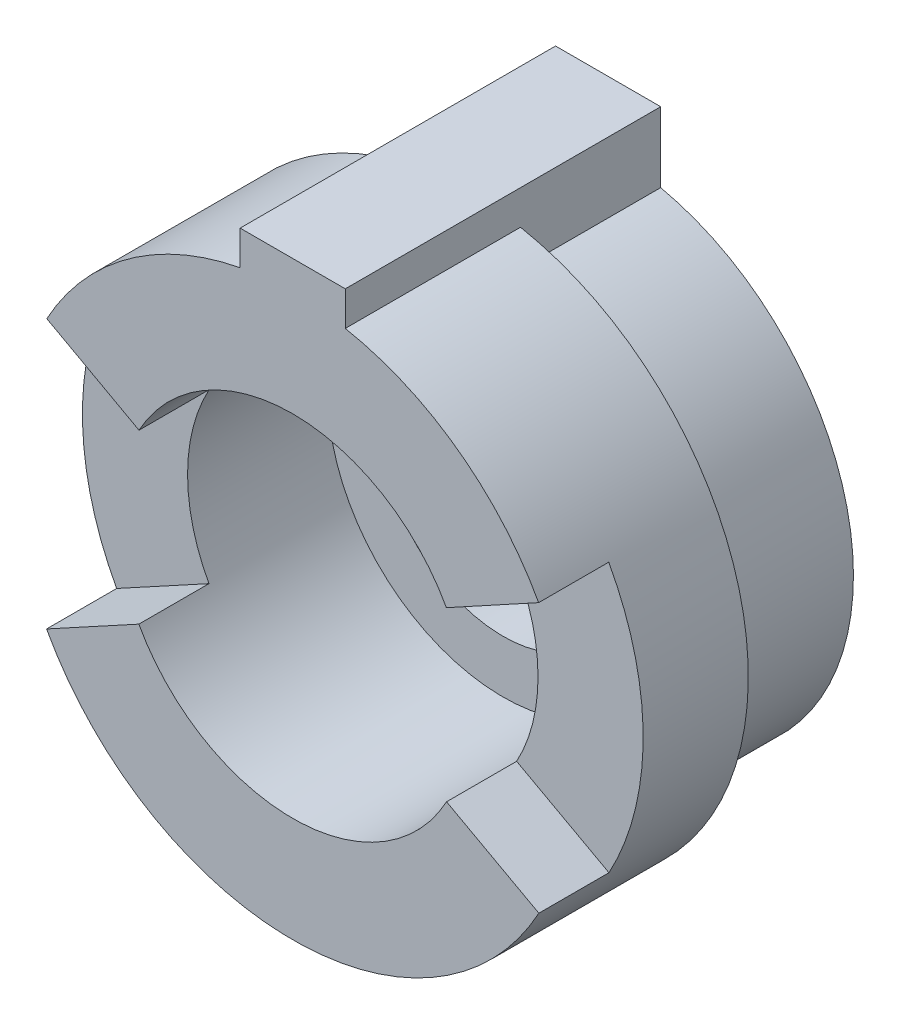
ISO-10303-21;
HEADER;
FILE_DESCRIPTION(('STEP AP214'),'2;1');
FILE_NAME('part.step','',(''),(''),'','','');
FILE_SCHEMA(('AUTOMOTIVE_DESIGN { 1 0 10303 214 1 1 1 1 }'));
ENDSEC;
DATA;
#1=APPLICATION_CONTEXT('core data for automotive mechanical design processes');
#2=APPLICATION_PROTOCOL_DEFINITION('international standard','automotive_design',2000,#1);
#3=PRODUCT_CONTEXT('',#1,'mechanical');
#4=PRODUCT('Part','Part','',(#3));
#5=PRODUCT_RELATED_PRODUCT_CATEGORY('part','',(#4));
#6=PRODUCT_DEFINITION_FORMATION('','',#4);
#7=PRODUCT_DEFINITION_CONTEXT('part definition',#1,'design');
#8=PRODUCT_DEFINITION('design','',#6,#7);
#9=PRODUCT_DEFINITION_SHAPE('','',#8);
#10=(LENGTH_UNIT() NAMED_UNIT(*) SI_UNIT(.MILLI.,.METRE.));
#11=(NAMED_UNIT(*) PLANE_ANGLE_UNIT() SI_UNIT($,.RADIAN.));
#12=(NAMED_UNIT(*) SI_UNIT($,.STERADIAN.) SOLID_ANGLE_UNIT());
#13=UNCERTAINTY_MEASURE_WITH_UNIT(LENGTH_MEASURE(1.E-05),#10,'distance_accuracy_value','');
#14=(GEOMETRIC_REPRESENTATION_CONTEXT(3) GLOBAL_UNCERTAINTY_ASSIGNED_CONTEXT((#13)) GLOBAL_UNIT_ASSIGNED_CONTEXT((#10,
#11,#12)) REPRESENTATION_CONTEXT('',''));
#15=CARTESIAN_POINT('',(0.,0.,0.));
#16=DIRECTION('',(0.,0.,1.));
#17=DIRECTION('',(1.,0.,0.));
#18=AXIS2_PLACEMENT_3D('',#15,#16,#17);
#19=CARTESIAN_POINT('',(0.,0.,9.));
#20=DIRECTION('',(0.,0.,1.));
#21=DIRECTION('',(1.,0.,0.));
#22=AXIS2_PLACEMENT_3D('',#19,#20,#21);
#23=PLANE('',#22);
#24=DIRECTION('',(-0.877200504274681,0.480124229028535,0.));
#25=VECTOR('',#24,1.);
#26=CARTESIAN_POINT('',(-7.01760403419745,3.84099383222828,9.));
#27=LINE('',#26,#25);
#28=CARTESIAN_POINT('',(-4.38600252137341,2.40062114514268,9.));
#29=VERTEX_POINT('',#28);
#30=CARTESIAN_POINT('',(-7.01760403419745,3.84099383222828,9.));
#31=VERTEX_POINT('',#30);
#32=EDGE_CURVE('E238',#29,#31,#27,.T.);
#33=ORIENTED_EDGE('',*,*,#32,.F.);
#34=CARTESIAN_POINT('',(0.,0.,9.));
#35=DIRECTION('',(0.,0.,1.));
#36=DIRECTION('',(1.,0.,0.));
#37=AXIS2_PLACEMENT_3D('',#34,#35,#36);
#38=CIRCLE('',#37,5.);
#39=CARTESIAN_POINT('',(4.38600252137341,2.40062114514267,9.));
#40=VERTEX_POINT('',#39);
#41=EDGE_CURVE('E260',#40,#29,#38,.T.);
#42=ORIENTED_EDGE('',*,*,#41,.F.);
#43=DIRECTION('',(0.877200504274682,0.480124229028534,0.));
#44=VECTOR('',#43,1.);
#45=CARTESIAN_POINT('',(7.01760403419745,3.84099383222827,9.));
#46=LINE('',#45,#44);
#47=CARTESIAN_POINT('',(7.01760403419745,3.84099383222827,9.));
#48=VERTEX_POINT('',#47);
#49=EDGE_CURVE('E92',#40,#48,#46,.T.);
#50=ORIENTED_EDGE('',*,*,#49,.T.);
#51=CARTESIAN_POINT('',(0.,0.,9.));
#52=DIRECTION('',(0.,0.,1.));
#53=DIRECTION('',(1.,0.,0.));
#54=AXIS2_PLACEMENT_3D('',#51,#52,#53);
#55=CIRCLE('',#54,8.);
#56=CARTESIAN_POINT('',(1.50000000000014,7.85811682275083,9.));
#57=VERTEX_POINT('',#56);
#58=EDGE_CURVE('E190',#48,#57,#55,.T.);
#59=ORIENTED_EDGE('',*,*,#58,.T.);
#60=DIRECTION('',(0.,-1.,0.));
#61=VECTOR('',#60,1.);
#62=CARTESIAN_POINT('',(1.50000000000014,7.85811682275083,9.));
#63=LINE('',#62,#61);
#64=CARTESIAN_POINT('',(1.50000000000014,8.83739716558864,9.));
#65=VERTEX_POINT('',#64);
#66=EDGE_CURVE('E171',#65,#57,#63,.T.);
#67=ORIENTED_EDGE('',*,*,#66,.F.);
#68=DIRECTION('',(1.,0.,0.));
#69=VECTOR('',#68,1.);
#70=CARTESIAN_POINT('',(1.50000000000014,8.83739716558864,9.));
#71=LINE('',#70,#69);
#72=CARTESIAN_POINT('',(-1.49999999999986,8.83739716558864,9.));
#73=VERTEX_POINT('',#72);
#74=EDGE_CURVE('E187',#73,#65,#71,.T.);
#75=ORIENTED_EDGE('',*,*,#74,.F.);
#76=DIRECTION('',(0.,1.,0.));
#77=VECTOR('',#76,1.);
#78=CARTESIAN_POINT('',(-1.49999999999986,8.83739716558864,9.));
#79=LINE('',#78,#77);
#80=CARTESIAN_POINT('',(-1.49999999999986,7.85811682275088,9.));
#81=VERTEX_POINT('',#80);
#82=EDGE_CURVE('E180',#81,#73,#79,.T.);
#83=ORIENTED_EDGE('',*,*,#82,.F.);
#84=EDGE_CURVE('E266',#81,#31,#55,.T.);
#85=ORIENTED_EDGE('',*,*,#84,.T.);
#86=EDGE_LOOP('',(#33,#42,#50,#59,#67,#75,#83,#85));
#87=FACE_BOUND('',#86,.T.);
#88=ADVANCED_FACE('F69',(#87),#23,.T.);
#89=CARTESIAN_POINT('',(0.,0.,3.));
#90=DIRECTION('',(0.,0.,1.));
#91=DIRECTION('',(1.,0.,0.));
#92=AXIS2_PLACEMENT_3D('',#89,#90,#91);
#93=PLANE('',#92);
#94=CARTESIAN_POINT('',(0.,0.,3.));
#95=DIRECTION('',(0.,0.,1.));
#96=DIRECTION('',(1.,0.,0.));
#97=AXIS2_PLACEMENT_3D('',#94,#95,#96);
#98=CIRCLE('',#97,5.);
#99=CARTESIAN_POINT('',(5.,0.,3.));
#100=VERTEX_POINT('',#99);
#101=EDGE_CURVE('E270',#100,#100,#98,.F.);
#102=ORIENTED_EDGE('',*,*,#101,.F.);
#103=EDGE_LOOP('',(#102));
#104=FACE_BOUND('',#103,.T.);
#105=CARTESIAN_POINT('',(0.,0.,3.));
#106=DIRECTION('',(0.,0.,1.));
#107=DIRECTION('',(1.,0.,0.));
#108=AXIS2_PLACEMENT_3D('',#105,#106,#107);
#109=CIRCLE('',#108,3.5);
#110=CARTESIAN_POINT('',(3.5,0.,3.));
#111=VERTEX_POINT('',#110);
#112=EDGE_CURVE('E267',#111,#111,#109,.T.);
#113=ORIENTED_EDGE('',*,*,#112,.F.);
#114=EDGE_LOOP('',(#113));
#115=FACE_BOUND('',#114,.T.);
#116=ADVANCED_FACE('F342',(#104,#115),#93,.T.);
#117=CARTESIAN_POINT('',(0.,0.,0.));
#118=DIRECTION('',(0.,0.,1.));
#119=DIRECTION('',(1.,0.,0.));
#120=AXIS2_PLACEMENT_3D('',#117,#118,#119);
#121=PLANE('',#120);
#122=DIRECTION('',(0.,-1.,0.));
#123=VECTOR('',#122,1.);
#124=CARTESIAN_POINT('',(-1.49999999999986,7.85811682275088,0.));
#125=LINE('',#124,#123);
#126=CARTESIAN_POINT('',(-1.49999999999986,8.83739716558864,0.));
#127=VERTEX_POINT('',#126);
#128=CARTESIAN_POINT('',(-1.49999999999987,6.8373971655887,0.));
#129=VERTEX_POINT('',#128);
#130=EDGE_CURVE('E201',#127,#129,#125,.T.);
#131=ORIENTED_EDGE('',*,*,#130,.F.);
#132=DIRECTION('',(1.,0.,0.));
#133=VECTOR('',#132,1.);
#134=CARTESIAN_POINT('',(1.50000000000014,8.83739716558864,0.));
#135=LINE('',#134,#133);
#136=CARTESIAN_POINT('',(1.50000000000014,8.83739716558864,0.));
#137=VERTEX_POINT('',#136);
#138=EDGE_CURVE('E195',#127,#137,#135,.T.);
#139=ORIENTED_EDGE('',*,*,#138,.T.);
#140=DIRECTION('',(0.,1.,0.));
#141=VECTOR('',#140,1.);
#142=CARTESIAN_POINT('',(1.50000000000014,6.83739716558864,0.));
#143=LINE('',#142,#141);
#144=CARTESIAN_POINT('',(1.50000000000014,6.83739716558864,0.));
#145=VERTEX_POINT('',#144);
#146=EDGE_CURVE('E174',#145,#137,#143,.T.);
#147=ORIENTED_EDGE('',*,*,#146,.F.);
#148=CARTESIAN_POINT('',(0.,0.,0.));
#149=DIRECTION('',(0.,0.,1.));
#150=DIRECTION('',(-1.,0.,0.));
#151=AXIS2_PLACEMENT_3D('',#148,#149,#150);
#152=CIRCLE('',#151,7.);
#153=EDGE_CURVE('E220',#129,#145,#152,.T.);
#154=ORIENTED_EDGE('',*,*,#153,.F.);
#155=EDGE_LOOP('',(#131,#139,#147,#154));
#156=FACE_BOUND('',#155,.T.);
#157=CARTESIAN_POINT('',(0.,0.,0.));
#158=DIRECTION('',(0.,0.,1.));
#159=DIRECTION('',(1.,0.,0.));
#160=AXIS2_PLACEMENT_3D('',#157,#158,#159);
#161=CIRCLE('',#160,3.5);
#162=CARTESIAN_POINT('',(3.5,0.,0.));
#163=VERTEX_POINT('',#162);
#164=EDGE_CURVE('E265',#163,#163,#161,.T.);
#165=ORIENTED_EDGE('',*,*,#164,.T.);
#166=EDGE_LOOP('',(#165));
#167=FACE_BOUND('',#166,.T.);
#168=ADVANCED_FACE('F328',(#156,#167),#121,.F.);
#169=CARTESIAN_POINT('',(0.,0.,3.));
#170=DIRECTION('',(0.,0.,-1.));
#171=DIRECTION('',(-1.,0.,0.));
#172=AXIS2_PLACEMENT_3D('',#169,#170,#171);
#173=CYLINDRICAL_SURFACE('',#172,8.);
#174=ORIENTED_EDGE('',*,*,#84,.F.);
#175=DIRECTION('',(0.,0.,-1.));
#176=VECTOR('',#175,1.);
#177=CARTESIAN_POINT('',(-1.49999999999986,7.85811682275088,9.));
#178=LINE('',#177,#176);
#179=CARTESIAN_POINT('',(-1.49999999999986,7.85811682275088,4.));
#180=VERTEX_POINT('',#179);
#181=EDGE_CURVE('E202',#81,#180,#178,.T.);
#182=ORIENTED_EDGE('',*,*,#181,.T.);
#183=CARTESIAN_POINT('',(0.,0.,4.));
#184=DIRECTION('',(0.,0.,-1.));
#185=DIRECTION('',(-1.,0.,0.));
#186=AXIS2_PLACEMENT_3D('',#183,#184,#185);
#187=CIRCLE('',#186,8.);
#188=CARTESIAN_POINT('',(1.50000000000014,7.85811682275083,4.));
#189=VERTEX_POINT('',#188);
#190=EDGE_CURVE('E205',#189,#180,#187,.T.);
#191=ORIENTED_EDGE('',*,*,#190,.F.);
#192=DIRECTION('',(0.,0.,-1.));
#193=VECTOR('',#192,1.);
#194=CARTESIAN_POINT('',(1.50000000000014,7.85811682275083,9.));
#195=LINE('',#194,#193);
#196=EDGE_CURVE('E179',#57,#189,#195,.T.);
#197=ORIENTED_EDGE('',*,*,#196,.F.);
#198=ORIENTED_EDGE('',*,*,#58,.F.);
#199=DIRECTION('',(0.,0.,1.));
#200=VECTOR('',#199,1.);
#201=CARTESIAN_POINT('',(7.01760403419745,3.84099383222827,7.));
#202=LINE('',#201,#200);
#203=CARTESIAN_POINT('',(7.01760403419745,3.84099383222827,7.));
#204=VERTEX_POINT('',#203);
#205=EDGE_CURVE('E246',#204,#48,#202,.T.);
#206=ORIENTED_EDGE('',*,*,#205,.F.);
#207=CARTESIAN_POINT('',(0.,0.,7.));
#208=DIRECTION('',(0.,0.,-1.));
#209=DIRECTION('',(0.877964062999077,-0.478726544158722,0.));
#210=AXIS2_PLACEMENT_3D('',#207,#208,#209);
#211=CIRCLE('',#210,8.);
#212=CARTESIAN_POINT('',(7.02371250399262,-3.82981235326977,7.));
#213=VERTEX_POINT('',#212);
#214=EDGE_CURVE('E242',#204,#213,#211,.T.);
#215=ORIENTED_EDGE('',*,*,#214,.T.);
#216=DIRECTION('',(0.,0.,-1.));
#217=VECTOR('',#216,1.);
#218=CARTESIAN_POINT('',(7.02371250399262,-3.82981235326977,9.));
#219=LINE('',#218,#217);
#220=CARTESIAN_POINT('',(7.02371250399262,-3.82981235326977,9.));
#221=VERTEX_POINT('',#220);
#222=EDGE_CURVE('E248',#221,#213,#219,.T.);
#223=ORIENTED_EDGE('',*,*,#222,.F.);
#224=CARTESIAN_POINT('',(-7.02371250399263,-3.82981235326976,9.));
#225=VERTEX_POINT('',#224);
#226=EDGE_CURVE('E263',#225,#221,#55,.T.);
#227=ORIENTED_EDGE('',*,*,#226,.F.);
#228=DIRECTION('',(0.,0.,1.));
#229=VECTOR('',#228,1.);
#230=CARTESIAN_POINT('',(-7.02371250399263,-3.82981235326976,7.));
#231=LINE('',#230,#229);
#232=CARTESIAN_POINT('',(-7.02371250399263,-3.82981235326976,7.));
#233=VERTEX_POINT('',#232);
#234=EDGE_CURVE('E230',#233,#225,#231,.T.);
#235=ORIENTED_EDGE('',*,*,#234,.F.);
#236=CARTESIAN_POINT('',(0.,0.,7.));
#237=DIRECTION('',(0.,0.,-1.));
#238=DIRECTION('',(-0.877200504274681,0.480124229028534,0.));
#239=AXIS2_PLACEMENT_3D('',#236,#237,#238);
#240=CIRCLE('',#239,8.);
#241=CARTESIAN_POINT('',(-7.01760403419745,3.84099383222828,7.));
#242=VERTEX_POINT('',#241);
#243=EDGE_CURVE('E226',#233,#242,#240,.T.);
#244=ORIENTED_EDGE('',*,*,#243,.T.);
#245=DIRECTION('',(0.,0.,-1.));
#246=VECTOR('',#245,1.);
#247=CARTESIAN_POINT('',(-7.01760403419745,3.84099383222828,9.));
#248=LINE('',#247,#246);
#249=EDGE_CURVE('E232',#31,#242,#248,.T.);
#250=ORIENTED_EDGE('',*,*,#249,.F.);
#251=EDGE_LOOP('',(#174,#182,#191,#197,#198,#206,#215,#223,#227,#235,#244,#250));
#252=FACE_BOUND('',#251,.T.);
#253=ADVANCED_FACE('F71',(#252),#173,.T.);
#254=CARTESIAN_POINT('',(0.,0.,3.));
#255=DIRECTION('',(0.,0.,-1.));
#256=DIRECTION('',(-1.,0.,0.));
#257=AXIS2_PLACEMENT_3D('',#254,#255,#256);
#258=CYLINDRICAL_SURFACE('',#257,3.5);
#259=ORIENTED_EDGE('',*,*,#112,.T.);
#260=EDGE_LOOP('',(#259));
#261=FACE_BOUND('',#260,.T.);
#262=ORIENTED_EDGE('',*,*,#164,.F.);
#263=EDGE_LOOP('',(#262));
#264=FACE_BOUND('',#263,.T.);
#265=ADVANCED_FACE('F352',(#261,#264),#258,.F.);
#266=DIRECTION('',(-0.877964062999078,-0.47872654415872,0.));
#267=VECTOR('',#266,1.);
#268=CARTESIAN_POINT('',(-7.02371250399263,-3.82981235326976,9.));
#269=LINE('',#268,#267);
#270=CARTESIAN_POINT('',(-4.38982031499539,-2.3936327207936,9.));
#271=VERTEX_POINT('',#270);
#272=EDGE_CURVE('E84',#271,#225,#269,.T.);
#273=ORIENTED_EDGE('',*,*,#272,.T.);
#274=ORIENTED_EDGE('',*,*,#226,.T.);
#275=DIRECTION('',(0.877964062999077,-0.478726544158722,0.));
#276=VECTOR('',#275,1.);
#277=CARTESIAN_POINT('',(7.02371250399262,-3.82981235326977,9.));
#278=LINE('',#277,#276);
#279=CARTESIAN_POINT('',(4.38982031499539,-2.39363272079361,9.));
#280=VERTEX_POINT('',#279);
#281=EDGE_CURVE('E254',#280,#221,#278,.T.);
#282=ORIENTED_EDGE('',*,*,#281,.F.);
#283=EDGE_CURVE('E258',#271,#280,#38,.T.);
#284=ORIENTED_EDGE('',*,*,#283,.F.);
#285=EDGE_LOOP('',(#273,#274,#282,#284));
#286=FACE_BOUND('',#285,.T.);
#287=ADVANCED_FACE('F306',(#286),#23,.T.);
#288=CARTESIAN_POINT('',(0.,0.,9.));
#289=DIRECTION('',(0.,0.,-1.));
#290=DIRECTION('',(-1.,0.,0.));
#291=AXIS2_PLACEMENT_3D('',#288,#289,#290);
#292=CYLINDRICAL_SURFACE('',#291,5.);
#293=DIRECTION('',(0.,0.,-1.));
#294=VECTOR('',#293,1.);
#295=CARTESIAN_POINT('',(-4.38600252137341,2.40062114514268,9.));
#296=LINE('',#295,#294);
#297=CARTESIAN_POINT('',(-4.38600252137341,2.40062114514268,7.));
#298=VERTEX_POINT('',#297);
#299=EDGE_CURVE('E13',#298,#29,#296,.F.);
#300=ORIENTED_EDGE('',*,*,#299,.F.);
#301=CARTESIAN_POINT('',(0.,0.,7.));
#302=DIRECTION('',(0.,0.,1.));
#303=DIRECTION('',(1.,0.,0.));
#304=AXIS2_PLACEMENT_3D('',#301,#302,#303);
#305=CIRCLE('',#304,5.);
#306=CARTESIAN_POINT('',(-4.38982031499539,-2.3936327207936,7.));
#307=VERTEX_POINT('',#306);
#308=EDGE_CURVE('E77',#307,#298,#305,.F.);
#309=ORIENTED_EDGE('',*,*,#308,.F.);
#310=DIRECTION('',(0.,0.,-1.));
#311=VECTOR('',#310,1.);
#312=CARTESIAN_POINT('',(-4.38982031499539,-2.3936327207936,9.));
#313=LINE('',#312,#311);
#314=EDGE_CURVE('E282',#271,#307,#313,.T.);
#315=ORIENTED_EDGE('',*,*,#314,.F.);
#316=ORIENTED_EDGE('',*,*,#283,.T.);
#317=DIRECTION('',(0.,0.,-1.));
#318=VECTOR('',#317,1.);
#319=CARTESIAN_POINT('',(4.38982031499539,-2.39363272079361,9.));
#320=LINE('',#319,#318);
#321=CARTESIAN_POINT('',(4.38982031499539,-2.39363272079361,7.));
#322=VERTEX_POINT('',#321);
#323=EDGE_CURVE('E279',#322,#280,#320,.F.);
#324=ORIENTED_EDGE('',*,*,#323,.F.);
#325=CARTESIAN_POINT('',(0.,0.,7.));
#326=DIRECTION('',(0.,0.,1.));
#327=DIRECTION('',(1.,0.,0.));
#328=AXIS2_PLACEMENT_3D('',#325,#326,#327);
#329=CIRCLE('',#328,5.);
#330=CARTESIAN_POINT('',(4.38600252137341,2.40062114514267,7.));
#331=VERTEX_POINT('',#330);
#332=EDGE_CURVE('E277',#331,#322,#329,.F.);
#333=ORIENTED_EDGE('',*,*,#332,.F.);
#334=DIRECTION('',(0.,0.,-1.));
#335=VECTOR('',#334,1.);
#336=CARTESIAN_POINT('',(4.38600252137341,2.40062114514267,9.));
#337=LINE('',#336,#335);
#338=EDGE_CURVE('E275',#40,#331,#337,.T.);
#339=ORIENTED_EDGE('',*,*,#338,.F.);
#340=ORIENTED_EDGE('',*,*,#41,.T.);
#341=EDGE_LOOP('',(#300,#309,#315,#316,#324,#333,#339,#340));
#342=FACE_BOUND('',#341,.T.);
#343=ORIENTED_EDGE('',*,*,#101,.T.);
#344=EDGE_LOOP('',(#343));
#345=FACE_BOUND('',#344,.T.);
#346=ADVANCED_FACE('F294',(#342,#345),#292,.F.);
#347=CARTESIAN_POINT('',(7.02371250399262,-3.82981235326977,8.));
#348=DIRECTION('',(-0.478726544158722,-0.877964062999077,0.));
#349=DIRECTION('',(0.,0.,-1.));
#350=AXIS2_PLACEMENT_3D('',#347,#348,#349);
#351=PLANE('',#350);
#352=ORIENTED_EDGE('',*,*,#323,.T.);
#353=ORIENTED_EDGE('',*,*,#281,.T.);
#354=ORIENTED_EDGE('',*,*,#222,.T.);
#355=DIRECTION('',(0.877964062999077,-0.478726544158722,0.));
#356=VECTOR('',#355,1.);
#357=CARTESIAN_POINT('',(7.02371250399262,-3.82981235326977,7.));
#358=LINE('',#357,#356);
#359=EDGE_CURVE('E252',#322,#213,#358,.T.);
#360=ORIENTED_EDGE('',*,*,#359,.F.);
#361=EDGE_LOOP('',(#352,#353,#354,#360));
#362=FACE_BOUND('',#361,.T.);
#363=ADVANCED_FACE('F311',(#362),#351,.F.);
#364=CARTESIAN_POINT('',(0.,0.,7.));
#365=DIRECTION('',(0.,0.,1.));
#366=DIRECTION('',(1.,0.,0.));
#367=AXIS2_PLACEMENT_3D('',#364,#365,#366);
#368=PLANE('',#367);
#369=ORIENTED_EDGE('',*,*,#332,.T.);
#370=ORIENTED_EDGE('',*,*,#359,.T.);
#371=ORIENTED_EDGE('',*,*,#214,.F.);
#372=DIRECTION('',(0.877200504274682,0.480124229028534,0.));
#373=VECTOR('',#372,1.);
#374=CARTESIAN_POINT('',(7.01760403419745,3.84099383222827,7.));
#375=LINE('',#374,#373);
#376=EDGE_CURVE('E251',#331,#204,#375,.T.);
#377=ORIENTED_EDGE('',*,*,#376,.F.);
#378=EDGE_LOOP('',(#369,#370,#371,#377));
#379=FACE_BOUND('',#378,.T.);
#380=ADVANCED_FACE('F314',(#379),#368,.T.);
#381=CARTESIAN_POINT('',(7.01760403419745,3.84099383222827,8.));
#382=DIRECTION('',(-0.480124229028534,0.877200504274682,0.));
#383=DIRECTION('',(0.,0.,1.));
#384=AXIS2_PLACEMENT_3D('',#381,#382,#383);
#385=PLANE('',#384);
#386=ORIENTED_EDGE('',*,*,#338,.T.);
#387=ORIENTED_EDGE('',*,*,#376,.T.);
#388=ORIENTED_EDGE('',*,*,#205,.T.);
#389=ORIENTED_EDGE('',*,*,#49,.F.);
#390=EDGE_LOOP('',(#386,#387,#388,#389));
#391=FACE_BOUND('',#390,.T.);
#392=ADVANCED_FACE('F317',(#391),#385,.F.);
#393=CARTESIAN_POINT('',(-7.01760403419745,3.84099383222828,8.));
#394=DIRECTION('',(0.480124229028535,0.877200504274681,0.));
#395=DIRECTION('',(0.,0.,-1.));
#396=AXIS2_PLACEMENT_3D('',#393,#394,#395);
#397=PLANE('',#396);
#398=ORIENTED_EDGE('',*,*,#299,.T.);
#399=ORIENTED_EDGE('',*,*,#32,.T.);
#400=ORIENTED_EDGE('',*,*,#249,.T.);
#401=DIRECTION('',(-0.877200504274681,0.480124229028535,0.));
#402=VECTOR('',#401,1.);
#403=CARTESIAN_POINT('',(-7.01760403419745,3.84099383222828,7.));
#404=LINE('',#403,#402);
#405=EDGE_CURVE('E236',#298,#242,#404,.T.);
#406=ORIENTED_EDGE('',*,*,#405,.F.);
#407=EDGE_LOOP('',(#398,#399,#400,#406));
#408=FACE_BOUND('',#407,.T.);
#409=ADVANCED_FACE('F292',(#408),#397,.F.);
#410=CARTESIAN_POINT('',(0.,0.,7.));
#411=DIRECTION('',(0.,0.,1.));
#412=DIRECTION('',(1.,0.,0.));
#413=AXIS2_PLACEMENT_3D('',#410,#411,#412);
#414=PLANE('',#413);
#415=ORIENTED_EDGE('',*,*,#308,.T.);
#416=ORIENTED_EDGE('',*,*,#405,.T.);
#417=ORIENTED_EDGE('',*,*,#243,.F.);
#418=DIRECTION('',(-0.877964062999078,-0.47872654415872,0.));
#419=VECTOR('',#418,1.);
#420=CARTESIAN_POINT('',(-7.02371250399263,-3.82981235326976,7.));
#421=LINE('',#420,#419);
#422=EDGE_CURVE('E235',#307,#233,#421,.T.);
#423=ORIENTED_EDGE('',*,*,#422,.F.);
#424=EDGE_LOOP('',(#415,#416,#417,#423));
#425=FACE_BOUND('',#424,.T.);
#426=ADVANCED_FACE('F287',(#425),#414,.T.);
#427=CARTESIAN_POINT('',(-7.02371250399263,-3.82981235326976,8.));
#428=DIRECTION('',(0.47872654415872,-0.877964062999078,0.));
#429=DIRECTION('',(0.,0.,1.));
#430=AXIS2_PLACEMENT_3D('',#427,#428,#429);
#431=PLANE('',#430);
#432=ORIENTED_EDGE('',*,*,#314,.T.);
#433=ORIENTED_EDGE('',*,*,#422,.T.);
#434=ORIENTED_EDGE('',*,*,#234,.T.);
#435=ORIENTED_EDGE('',*,*,#272,.F.);
#436=EDGE_LOOP('',(#432,#433,#434,#435));
#437=FACE_BOUND('',#436,.T.);
#438=ADVANCED_FACE('F303',(#437),#431,.F.);
#439=CARTESIAN_POINT('',(1.50000000000014,6.83739716558864,4.));
#440=DIRECTION('',(-1.,0.,0.));
#441=DIRECTION('',(0.,-1.,0.));
#442=AXIS2_PLACEMENT_3D('',#439,#440,#441);
#443=PLANE('',#442);
#444=ORIENTED_EDGE('',*,*,#146,.T.);
#445=DIRECTION('',(0.,0.,-1.));
#446=VECTOR('',#445,1.);
#447=CARTESIAN_POINT('',(1.50000000000014,8.83739716558864,9.));
#448=LINE('',#447,#446);
#449=EDGE_CURVE('E168',#65,#137,#448,.T.);
#450=ORIENTED_EDGE('',*,*,#449,.F.);
#451=ORIENTED_EDGE('',*,*,#66,.T.);
#452=ORIENTED_EDGE('',*,*,#196,.T.);
#453=DIRECTION('',(0.,1.,0.));
#454=VECTOR('',#453,1.);
#455=CARTESIAN_POINT('',(1.50000000000014,6.83739716558864,4.));
#456=LINE('',#455,#454);
#457=CARTESIAN_POINT('',(1.50000000000014,6.83739716558864,4.));
#458=VERTEX_POINT('',#457);
#459=EDGE_CURVE('E214',#458,#189,#456,.T.);
#460=ORIENTED_EDGE('',*,*,#459,.F.);
#461=DIRECTION('',(0.,0.,-1.));
#462=VECTOR('',#461,1.);
#463=CARTESIAN_POINT('',(1.50000000000014,6.83739716558864,4.));
#464=LINE('',#463,#462);
#465=EDGE_CURVE('E224',#458,#145,#464,.T.);
#466=ORIENTED_EDGE('',*,*,#465,.T.);
#467=EDGE_LOOP('',(#444,#450,#451,#452,#460,#466));
#468=FACE_BOUND('',#467,.T.);
#469=ADVANCED_FACE('F170',(#468),#443,.F.);
#470=CARTESIAN_POINT('',(0.,0.,4.));
#471=DIRECTION('',(0.,0.,-1.));
#472=DIRECTION('',(-1.,0.,0.));
#473=AXIS2_PLACEMENT_3D('',#470,#471,#472);
#474=CYLINDRICAL_SURFACE('',#473,7.);
#475=ORIENTED_EDGE('',*,*,#153,.T.);
#476=ORIENTED_EDGE('',*,*,#465,.F.);
#477=CARTESIAN_POINT('',(0.,0.,4.));
#478=DIRECTION('',(0.,0.,1.));
#479=DIRECTION('',(-1.,0.,0.));
#480=AXIS2_PLACEMENT_3D('',#477,#478,#479);
#481=CIRCLE('',#480,7.);
#482=CARTESIAN_POINT('',(-1.49999999999987,6.8373971655887,4.));
#483=VERTEX_POINT('',#482);
#484=EDGE_CURVE('E211',#483,#458,#481,.T.);
#485=ORIENTED_EDGE('',*,*,#484,.F.);
#486=DIRECTION('',(0.,0.,-1.));
#487=VECTOR('',#486,1.);
#488=CARTESIAN_POINT('',(-1.49999999999987,6.8373971655887,4.));
#489=LINE('',#488,#487);
#490=EDGE_CURVE('E217',#483,#129,#489,.T.);
#491=ORIENTED_EDGE('',*,*,#490,.T.);
#492=EDGE_LOOP('',(#475,#476,#485,#491));
#493=FACE_BOUND('',#492,.T.);
#494=ADVANCED_FACE('F325',(#493),#474,.T.);
#495=CARTESIAN_POINT('',(-1.49999999999986,7.85811682275088,4.));
#496=DIRECTION('',(1.,0.,0.));
#497=DIRECTION('',(0.,1.,0.));
#498=AXIS2_PLACEMENT_3D('',#495,#496,#497);
#499=PLANE('',#498);
#500=ORIENTED_EDGE('',*,*,#130,.T.);
#501=ORIENTED_EDGE('',*,*,#490,.F.);
#502=DIRECTION('',(0.,-1.,0.));
#503=VECTOR('',#502,1.);
#504=CARTESIAN_POINT('',(-1.49999999999986,7.85811682275088,4.));
#505=LINE('',#504,#503);
#506=EDGE_CURVE('E208',#180,#483,#505,.T.);
#507=ORIENTED_EDGE('',*,*,#506,.F.);
#508=ORIENTED_EDGE('',*,*,#181,.F.);
#509=ORIENTED_EDGE('',*,*,#82,.T.);
#510=DIRECTION('',(0.,0.,-1.));
#511=VECTOR('',#510,1.);
#512=CARTESIAN_POINT('',(-1.49999999999986,8.83739716558864,9.));
#513=LINE('',#512,#511);
#514=EDGE_CURVE('E194',#73,#127,#513,.T.);
#515=ORIENTED_EDGE('',*,*,#514,.T.);
#516=EDGE_LOOP('',(#500,#501,#507,#508,#509,#515));
#517=FACE_BOUND('',#516,.T.);
#518=ADVANCED_FACE('F331',(#517),#499,.F.);
#519=CARTESIAN_POINT('',(0.,0.,4.));
#520=DIRECTION('',(0.,0.,-1.));
#521=DIRECTION('',(-1.,0.,0.));
#522=AXIS2_PLACEMENT_3D('',#519,#520,#521);
#523=PLANE('',#522);
#524=ORIENTED_EDGE('',*,*,#190,.T.);
#525=ORIENTED_EDGE('',*,*,#506,.T.);
#526=ORIENTED_EDGE('',*,*,#484,.T.);
#527=ORIENTED_EDGE('',*,*,#459,.T.);
#528=EDGE_LOOP('',(#524,#525,#526,#527));
#529=FACE_BOUND('',#528,.T.);
#530=ADVANCED_FACE('F321',(#529),#523,.T.);
#531=CARTESIAN_POINT('',(1.50000000000014,8.83739716558864,9.));
#532=DIRECTION('',(0.,1.,0.));
#533=DIRECTION('',(0.,0.,1.));
#534=AXIS2_PLACEMENT_3D('',#531,#532,#533);
#535=PLANE('',#534);
#536=ORIENTED_EDGE('',*,*,#138,.F.);
#537=ORIENTED_EDGE('',*,*,#514,.F.);
#538=ORIENTED_EDGE('',*,*,#74,.T.);
#539=ORIENTED_EDGE('',*,*,#449,.T.);
#540=EDGE_LOOP('',(#536,#537,#538,#539));
#541=FACE_BOUND('',#540,.T.);
#542=ADVANCED_FACE('F192',(#541),#535,.T.);
#543=CLOSED_SHELL('',(#88,#116,#168,#253,#265,#287,#346,#363,#380,#392,#409,#426,#438,#469,#494,
#518,#530,#542));
#544=MANIFOLD_SOLID_BREP('B2',#543);
#545=ADVANCED_BREP_SHAPE_REPRESENTATION('',(#18,#544),#14);
#546=SHAPE_DEFINITION_REPRESENTATION(#9,#545);
ENDSEC;
END-ISO-10303-21;
